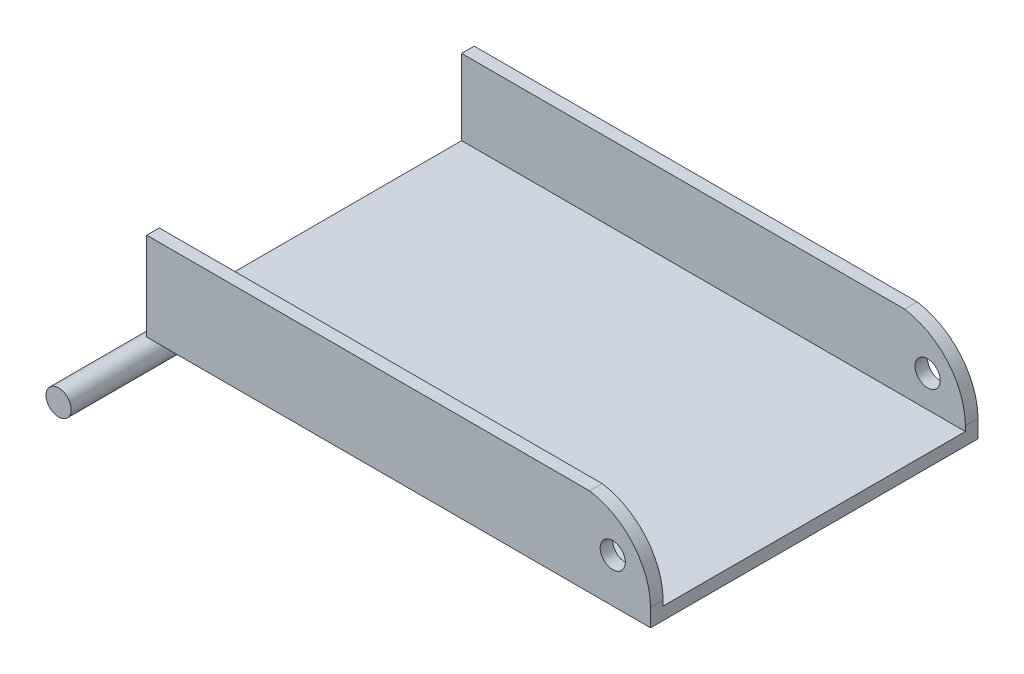
ISO-10303-21;
HEADER;
FILE_DESCRIPTION(('STEP AP214'),'2;1');
FILE_NAME('part.step','',(''),(''),'','','');
FILE_SCHEMA(('AUTOMOTIVE_DESIGN { 1 0 10303 214 1 1 1 1 }'));
ENDSEC;
DATA;
#1=APPLICATION_CONTEXT('core data for automotive mechanical design processes');
#2=APPLICATION_PROTOCOL_DEFINITION('international standard','automotive_design',2000,#1);
#3=PRODUCT_CONTEXT('',#1,'mechanical');
#4=PRODUCT('Part','Part','',(#3));
#5=PRODUCT_RELATED_PRODUCT_CATEGORY('part','',(#4));
#6=PRODUCT_DEFINITION_FORMATION('','',#4);
#7=PRODUCT_DEFINITION_CONTEXT('part definition',#1,'design');
#8=PRODUCT_DEFINITION('design','',#6,#7);
#9=PRODUCT_DEFINITION_SHAPE('','',#8);
#10=(LENGTH_UNIT() NAMED_UNIT(*) SI_UNIT(.MILLI.,.METRE.));
#11=(NAMED_UNIT(*) PLANE_ANGLE_UNIT() SI_UNIT($,.RADIAN.));
#12=(NAMED_UNIT(*) SI_UNIT($,.STERADIAN.) SOLID_ANGLE_UNIT());
#13=UNCERTAINTY_MEASURE_WITH_UNIT(LENGTH_MEASURE(1.E-05),#10,'distance_accuracy_value','');
#14=(GEOMETRIC_REPRESENTATION_CONTEXT(3) GLOBAL_UNCERTAINTY_ASSIGNED_CONTEXT((#13)) GLOBAL_UNIT_ASSIGNED_CONTEXT((#10,
#11,#12)) REPRESENTATION_CONTEXT('',''));
#15=CARTESIAN_POINT('',(0.,0.,0.));
#16=DIRECTION('',(0.,0.,1.));
#17=DIRECTION('',(1.,0.,0.));
#18=AXIS2_PLACEMENT_3D('',#15,#16,#17);
#19=CARTESIAN_POINT('',(200.,5.,165.));
#20=DIRECTION('',(0.,0.,-1.));
#21=DIRECTION('',(0.,1.,0.));
#22=AXIS2_PLACEMENT_3D('',#19,#20,#21);
#23=PLANE('',#22);
#24=CARTESIAN_POINT('',(185.,22.5,165.));
#25=DIRECTION('',(0.,0.,1.));
#26=DIRECTION('',(1.,0.,0.));
#27=AXIS2_PLACEMENT_3D('',#24,#25,#26);
#28=CIRCLE('',#27,4.99999999999999);
#29=CARTESIAN_POINT('',(190.,22.5,165.));
#30=VERTEX_POINT('',#29);
#31=EDGE_CURVE('E187',#30,#30,#28,.T.);
#32=ORIENTED_EDGE('',*,*,#31,.F.);
#33=EDGE_LOOP('',(#32));
#34=FACE_BOUND('',#33,.T.);
#35=DIRECTION('',(0.,-1.,0.));
#36=VECTOR('',#35,1.);
#37=CARTESIAN_POINT('',(200.,5.,165.));
#38=LINE('',#37,#36);
#39=CARTESIAN_POINT('',(200.,11.9855281187863,165.));
#40=VERTEX_POINT('',#39);
#41=CARTESIAN_POINT('',(200.,5.,165.));
#42=VERTEX_POINT('',#41);
#43=EDGE_CURVE('E140',#40,#42,#38,.T.);
#44=ORIENTED_EDGE('',*,*,#43,.F.);
#45=CARTESIAN_POINT('',(171.395114432779,11.7403807463684,165.));
#46=DIRECTION('',(0.,0.,-1.));
#47=DIRECTION('',(-1.,0.,0.));
#48=AXIS2_PLACEMENT_3D('',#45,#46,#47);
#49=CIRCLE('',#48,28.6059360194354);
#50=CARTESIAN_POINT('',(175.83284979981,40.,165.));
#51=VERTEX_POINT('',#50);
#52=EDGE_CURVE('E126',#51,#40,#49,.T.);
#53=ORIENTED_EDGE('',*,*,#52,.F.);
#54=DIRECTION('',(1.,0.,0.));
#55=VECTOR('',#54,1.);
#56=CARTESIAN_POINT('',(0.,40.,165.));
#57=LINE('',#56,#55);
#58=CARTESIAN_POINT('',(0.,40.,165.));
#59=VERTEX_POINT('',#58);
#60=EDGE_CURVE('E212',#59,#51,#57,.T.);
#61=ORIENTED_EDGE('',*,*,#60,.F.);
#62=DIRECTION('',(0.,-1.,0.));
#63=VECTOR('',#62,1.);
#64=CARTESIAN_POINT('',(0.,5.,165.));
#65=LINE('',#64,#63);
#66=CARTESIAN_POINT('',(0.,5.,165.));
#67=VERTEX_POINT('',#66);
#68=EDGE_CURVE('E170',#59,#67,#65,.T.);
#69=ORIENTED_EDGE('',*,*,#68,.T.);
#70=DIRECTION('',(-1.,0.,0.));
#71=VECTOR('',#70,1.);
#72=CARTESIAN_POINT('',(200.,5.,165.));
#73=LINE('',#72,#71);
#74=EDGE_CURVE('E60',#42,#67,#73,.T.);
#75=ORIENTED_EDGE('',*,*,#74,.F.);
#76=EDGE_LOOP('',(#44,#53,#61,#69,#75));
#77=FACE_BOUND('',#76,.T.);
#78=ADVANCED_FACE('F52',(#34,#77),#23,.F.);
#79=CARTESIAN_POINT('',(200.,5.00000000000002,35.));
#80=DIRECTION('',(0.,0.,1.));
#81=DIRECTION('',(0.,-1.,0.));
#82=AXIS2_PLACEMENT_3D('',#79,#80,#81);
#83=PLANE('',#82);
#84=CARTESIAN_POINT('',(185.,22.5,35.0000000000001));
#85=DIRECTION('',(0.,0.,1.));
#86=DIRECTION('',(0.,-1.,0.));
#87=AXIS2_PLACEMENT_3D('',#84,#85,#86);
#88=CIRCLE('',#87,4.99999999999999);
#89=CARTESIAN_POINT('',(185.,17.5,35.0000000000001));
#90=VERTEX_POINT('',#89);
#91=EDGE_CURVE('E193',#90,#90,#88,.T.);
#92=ORIENTED_EDGE('',*,*,#91,.T.);
#93=EDGE_LOOP('',(#92));
#94=FACE_BOUND('',#93,.T.);
#95=DIRECTION('',(-1.,0.,0.));
#96=VECTOR('',#95,1.);
#97=CARTESIAN_POINT('',(0.,40.,35.));
#98=LINE('',#97,#96);
#99=CARTESIAN_POINT('',(175.83284979981,40.,35.));
#100=VERTEX_POINT('',#99);
#101=CARTESIAN_POINT('',(0.,40.,35.));
#102=VERTEX_POINT('',#101);
#103=EDGE_CURVE('E236',#100,#102,#98,.T.);
#104=ORIENTED_EDGE('',*,*,#103,.F.);
#105=CARTESIAN_POINT('',(171.395114432779,11.7403807463684,35.));
#106=DIRECTION('',(0.,0.,1.));
#107=DIRECTION('',(0.,-1.,0.));
#108=AXIS2_PLACEMENT_3D('',#105,#106,#107);
#109=CIRCLE('',#108,28.6059360194354);
#110=CARTESIAN_POINT('',(200.,11.9855281187863,35.));
#111=VERTEX_POINT('',#110);
#112=EDGE_CURVE('E67',#100,#111,#109,.F.);
#113=ORIENTED_EDGE('',*,*,#112,.T.);
#114=DIRECTION('',(0.,1.,0.));
#115=VECTOR('',#114,1.);
#116=CARTESIAN_POINT('',(200.,5.00000000000002,35.));
#117=LINE('',#116,#115);
#118=CARTESIAN_POINT('',(200.,5.00000000000002,35.));
#119=VERTEX_POINT('',#118);
#120=EDGE_CURVE('E156',#119,#111,#117,.T.);
#121=ORIENTED_EDGE('',*,*,#120,.F.);
#122=DIRECTION('',(-1.,0.,0.));
#123=VECTOR('',#122,1.);
#124=CARTESIAN_POINT('',(200.,5.00000000000002,35.));
#125=LINE('',#124,#123);
#126=CARTESIAN_POINT('',(0.,5.00000000000002,35.));
#127=VERTEX_POINT('',#126);
#128=EDGE_CURVE('E169',#119,#127,#125,.T.);
#129=ORIENTED_EDGE('',*,*,#128,.T.);
#130=DIRECTION('',(0.,1.,0.));
#131=VECTOR('',#130,1.);
#132=CARTESIAN_POINT('',(0.,5.00000000000002,35.));
#133=LINE('',#132,#131);
#134=EDGE_CURVE('E158',#127,#102,#133,.T.);
#135=ORIENTED_EDGE('',*,*,#134,.T.);
#136=EDGE_LOOP('',(#104,#113,#121,#129,#135));
#137=FACE_BOUND('',#136,.T.);
#138=ADVANCED_FACE('F277',(#94,#137),#83,.F.);
#139=CARTESIAN_POINT('',(0.,40.,40.));
#140=DIRECTION('',(0.,0.,-1.));
#141=DIRECTION('',(0.,1.,0.));
#142=AXIS2_PLACEMENT_3D('',#139,#140,#141);
#143=PLANE('',#142);
#144=CARTESIAN_POINT('',(185.,22.5,40.));
#145=DIRECTION('',(0.,0.,-1.));
#146=DIRECTION('',(0.,1.,0.));
#147=AXIS2_PLACEMENT_3D('',#144,#145,#146);
#148=CIRCLE('',#147,4.99999999999999);
#149=CARTESIAN_POINT('',(185.,27.5,40.));
#150=VERTEX_POINT('',#149);
#151=EDGE_CURVE('E186',#150,#150,#148,.T.);
#152=ORIENTED_EDGE('',*,*,#151,.T.);
#153=EDGE_LOOP('',(#152));
#154=FACE_BOUND('',#153,.T.);
#155=DIRECTION('',(0.,-1.,0.));
#156=VECTOR('',#155,1.);
#157=CARTESIAN_POINT('',(200.,40.,40.));
#158=LINE('',#157,#156);
#159=CARTESIAN_POINT('',(200.,11.9855281187863,40.));
#160=VERTEX_POINT('',#159);
#161=CARTESIAN_POINT('',(200.,10.,40.));
#162=VERTEX_POINT('',#161);
#163=EDGE_CURVE('E239',#160,#162,#158,.T.);
#164=ORIENTED_EDGE('',*,*,#163,.F.);
#165=CARTESIAN_POINT('',(171.395114432779,11.7403807463684,40.));
#166=DIRECTION('',(0.,0.,-1.));
#167=DIRECTION('',(0.,1.,0.));
#168=AXIS2_PLACEMENT_3D('',#165,#166,#167);
#169=CIRCLE('',#168,28.6059360194354);
#170=CARTESIAN_POINT('',(175.83284979981,40.,40.));
#171=VERTEX_POINT('',#170);
#172=EDGE_CURVE('E200',#160,#171,#169,.F.);
#173=ORIENTED_EDGE('',*,*,#172,.T.);
#174=DIRECTION('',(1.,0.,0.));
#175=VECTOR('',#174,1.);
#176=CARTESIAN_POINT('',(0.,40.,40.));
#177=LINE('',#176,#175);
#178=CARTESIAN_POINT('',(0.,40.,40.));
#179=VERTEX_POINT('',#178);
#180=EDGE_CURVE('E232',#179,#171,#177,.T.);
#181=ORIENTED_EDGE('',*,*,#180,.F.);
#182=DIRECTION('',(0.,-1.,0.));
#183=VECTOR('',#182,1.);
#184=CARTESIAN_POINT('',(0.,40.,40.));
#185=LINE('',#184,#183);
#186=CARTESIAN_POINT('',(0.,10.,40.));
#187=VERTEX_POINT('',#186);
#188=EDGE_CURVE('E161',#179,#187,#185,.T.);
#189=ORIENTED_EDGE('',*,*,#188,.T.);
#190=DIRECTION('',(1.,0.,0.));
#191=VECTOR('',#190,1.);
#192=CARTESIAN_POINT('',(0.,10.,40.));
#193=LINE('',#192,#191);
#194=EDGE_CURVE('E227',#187,#162,#193,.T.);
#195=ORIENTED_EDGE('',*,*,#194,.T.);
#196=EDGE_LOOP('',(#164,#173,#181,#189,#195));
#197=FACE_BOUND('',#196,.T.);
#198=ADVANCED_FACE('F250',(#154,#197),#143,.F.);
#199=CARTESIAN_POINT('',(0.,40.,160.));
#200=DIRECTION('',(0.,0.,1.));
#201=DIRECTION('',(0.,-1.,0.));
#202=AXIS2_PLACEMENT_3D('',#199,#200,#201);
#203=PLANE('',#202);
#204=CARTESIAN_POINT('',(185.,22.5,160.));
#205=DIRECTION('',(0.,0.,1.));
#206=DIRECTION('',(0.,-1.,0.));
#207=AXIS2_PLACEMENT_3D('',#204,#205,#206);
#208=CIRCLE('',#207,4.99999999999999);
#209=CARTESIAN_POINT('',(185.,17.5,160.));
#210=VERTEX_POINT('',#209);
#211=EDGE_CURVE('E183',#210,#210,#208,.T.);
#212=ORIENTED_EDGE('',*,*,#211,.T.);
#213=EDGE_LOOP('',(#212));
#214=FACE_BOUND('',#213,.T.);
#215=DIRECTION('',(-1.,0.,0.));
#216=VECTOR('',#215,1.);
#217=CARTESIAN_POINT('',(0.,40.,160.));
#218=LINE('',#217,#216);
#219=CARTESIAN_POINT('',(175.83284979981,40.,160.));
#220=VERTEX_POINT('',#219);
#221=CARTESIAN_POINT('',(0.,40.,160.));
#222=VERTEX_POINT('',#221);
#223=EDGE_CURVE('E215',#220,#222,#218,.T.);
#224=ORIENTED_EDGE('',*,*,#223,.F.);
#225=CARTESIAN_POINT('',(171.395114432779,11.7403807463684,160.));
#226=DIRECTION('',(0.,0.,1.));
#227=DIRECTION('',(0.,-1.,0.));
#228=AXIS2_PLACEMENT_3D('',#225,#226,#227);
#229=CIRCLE('',#228,28.6059360194354);
#230=CARTESIAN_POINT('',(200.,11.9855281187863,160.));
#231=VERTEX_POINT('',#230);
#232=EDGE_CURVE('E75',#220,#231,#229,.F.);
#233=ORIENTED_EDGE('',*,*,#232,.T.);
#234=DIRECTION('',(0.,-1.,0.));
#235=VECTOR('',#234,1.);
#236=CARTESIAN_POINT('',(200.,40.,160.));
#237=LINE('',#236,#235);
#238=CARTESIAN_POINT('',(200.,10.,160.));
#239=VERTEX_POINT('',#238);
#240=EDGE_CURVE('E143',#231,#239,#237,.T.);
#241=ORIENTED_EDGE('',*,*,#240,.T.);
#242=DIRECTION('',(-1.,0.,0.));
#243=VECTOR('',#242,1.);
#244=CARTESIAN_POINT('',(0.,10.,160.));
#245=LINE('',#244,#243);
#246=CARTESIAN_POINT('',(0.,10.,160.));
#247=VERTEX_POINT('',#246);
#248=EDGE_CURVE('E207',#239,#247,#245,.T.);
#249=ORIENTED_EDGE('',*,*,#248,.T.);
#250=DIRECTION('',(0.,-1.,0.));
#251=VECTOR('',#250,1.);
#252=CARTESIAN_POINT('',(0.,40.,160.));
#253=LINE('',#252,#251);
#254=EDGE_CURVE('E218',#222,#247,#253,.T.);
#255=ORIENTED_EDGE('',*,*,#254,.F.);
#256=EDGE_LOOP('',(#224,#233,#241,#249,#255));
#257=FACE_BOUND('',#256,.T.);
#258=ADVANCED_FACE('F264',(#214,#257),#203,.F.);
#259=CARTESIAN_POINT('',(200.,10.,165.));
#260=DIRECTION('',(0.,-1.,0.));
#261=DIRECTION('',(0.,0.,-1.));
#262=AXIS2_PLACEMENT_3D('',#259,#260,#261);
#263=PLANE('',#262);
#264=ORIENTED_EDGE('',*,*,#248,.F.);
#265=DIRECTION('',(0.,0.,1.));
#266=VECTOR('',#265,1.);
#267=CARTESIAN_POINT('',(200.,10.,165.));
#268=LINE('',#267,#266);
#269=EDGE_CURVE('E166',#162,#239,#268,.T.);
#270=ORIENTED_EDGE('',*,*,#269,.F.);
#271=ORIENTED_EDGE('',*,*,#194,.F.);
#272=DIRECTION('',(0.,0.,1.));
#273=VECTOR('',#272,1.);
#274=CARTESIAN_POINT('',(0.,10.,165.));
#275=LINE('',#274,#273);
#276=EDGE_CURVE('E152',#187,#247,#275,.T.);
#277=ORIENTED_EDGE('',*,*,#276,.T.);
#278=EDGE_LOOP('',(#264,#270,#271,#277));
#279=FACE_BOUND('',#278,.T.);
#280=ADVANCED_FACE('F261',(#279),#263,.F.);
#281=CARTESIAN_POINT('',(200.,5.,165.));
#282=DIRECTION('',(0.,1.,0.));
#283=DIRECTION('',(0.,0.,1.));
#284=AXIS2_PLACEMENT_3D('',#281,#282,#283);
#285=PLANE('',#284);
#286=DIRECTION('',(0.,0.,-1.));
#287=VECTOR('',#286,1.);
#288=CARTESIAN_POINT('',(0.,5.,165.));
#289=LINE('',#288,#287);
#290=EDGE_CURVE('E173',#67,#127,#289,.T.);
#291=ORIENTED_EDGE('',*,*,#290,.T.);
#292=ORIENTED_EDGE('',*,*,#128,.F.);
#293=DIRECTION('',(0.,0.,-1.));
#294=VECTOR('',#293,1.);
#295=CARTESIAN_POINT('',(200.,5.,165.));
#296=LINE('',#295,#294);
#297=EDGE_CURVE('E151',#42,#119,#296,.T.);
#298=ORIENTED_EDGE('',*,*,#297,.F.);
#299=ORIENTED_EDGE('',*,*,#74,.T.);
#300=EDGE_LOOP('',(#291,#292,#298,#299));
#301=FACE_BOUND('',#300,.T.);
#302=ADVANCED_FACE('F280',(#301),#285,.F.);
#303=CARTESIAN_POINT('',(200.,0.,0.));
#304=DIRECTION('',(-1.,0.,0.));
#305=DIRECTION('',(0.,0.,1.));
#306=AXIS2_PLACEMENT_3D('',#303,#304,#305);
#307=PLANE('',#306);
#308=ORIENTED_EDGE('',*,*,#120,.T.);
#309=DIRECTION('',(0.,0.,1.));
#310=VECTOR('',#309,1.);
#311=CARTESIAN_POINT('',(200.,11.9855281187863,0.));
#312=LINE('',#311,#310);
#313=EDGE_CURVE('E145',#111,#160,#312,.T.);
#314=ORIENTED_EDGE('',*,*,#313,.T.);
#315=ORIENTED_EDGE('',*,*,#163,.T.);
#316=ORIENTED_EDGE('',*,*,#269,.T.);
#317=ORIENTED_EDGE('',*,*,#240,.F.);
#318=EDGE_CURVE('E129',#231,#40,#312,.T.);
#319=ORIENTED_EDGE('',*,*,#318,.T.);
#320=ORIENTED_EDGE('',*,*,#43,.T.);
#321=ORIENTED_EDGE('',*,*,#297,.T.);
#322=EDGE_LOOP('',(#308,#314,#315,#316,#317,#319,#320,#321));
#323=FACE_BOUND('',#322,.T.);
#324=ADVANCED_FACE('F139',(#323),#307,.F.);
#325=CARTESIAN_POINT('',(0.,0.,0.));
#326=DIRECTION('',(-1.,0.,0.));
#327=DIRECTION('',(0.,0.,1.));
#328=AXIS2_PLACEMENT_3D('',#325,#326,#327);
#329=PLANE('',#328);
#330=ORIENTED_EDGE('',*,*,#68,.F.);
#331=DIRECTION('',(0.,0.,1.));
#332=VECTOR('',#331,1.);
#333=CARTESIAN_POINT('',(0.,40.,165.));
#334=LINE('',#333,#332);
#335=EDGE_CURVE('E208',#222,#59,#334,.T.);
#336=ORIENTED_EDGE('',*,*,#335,.F.);
#337=ORIENTED_EDGE('',*,*,#254,.T.);
#338=ORIENTED_EDGE('',*,*,#276,.F.);
#339=ORIENTED_EDGE('',*,*,#188,.F.);
#340=DIRECTION('',(0.,0.,1.));
#341=VECTOR('',#340,1.);
#342=CARTESIAN_POINT('',(0.,40.,35.));
#343=LINE('',#342,#341);
#344=EDGE_CURVE('E228',#102,#179,#343,.T.);
#345=ORIENTED_EDGE('',*,*,#344,.F.);
#346=ORIENTED_EDGE('',*,*,#134,.F.);
#347=ORIENTED_EDGE('',*,*,#290,.F.);
#348=EDGE_LOOP('',(#330,#336,#337,#338,#339,#345,#346,#347));
#349=FACE_BOUND('',#348,.T.);
#350=ADVANCED_FACE('F255',(#349),#329,.T.);
#351=CARTESIAN_POINT('',(0.,40.,0.));
#352=DIRECTION('',(0.,1.,0.));
#353=DIRECTION('',(0.,0.,1.));
#354=AXIS2_PLACEMENT_3D('',#351,#352,#353);
#355=PLANE('',#354);
#356=DIRECTION('',(0.,0.,1.));
#357=VECTOR('',#356,1.);
#358=CARTESIAN_POINT('',(175.83284979981,40.,0.));
#359=LINE('',#358,#357);
#360=EDGE_CURVE('E266',#100,#171,#359,.T.);
#361=ORIENTED_EDGE('',*,*,#360,.F.);
#362=ORIENTED_EDGE('',*,*,#103,.T.);
#363=ORIENTED_EDGE('',*,*,#344,.T.);
#364=ORIENTED_EDGE('',*,*,#180,.T.);
#365=EDGE_LOOP('',(#361,#362,#363,#364));
#366=FACE_BOUND('',#365,.T.);
#367=ADVANCED_FACE('F274',(#366),#355,.T.);
#368=CARTESIAN_POINT('',(0.,40.0000000000001,0.));
#369=DIRECTION('',(0.,-1.,0.));
#370=DIRECTION('',(0.,0.,-1.));
#371=AXIS2_PLACEMENT_3D('',#368,#369,#370);
#372=PLANE('',#371);
#373=ORIENTED_EDGE('',*,*,#60,.T.);
#374=DIRECTION('',(0.,0.,-1.));
#375=VECTOR('',#374,1.);
#376=CARTESIAN_POINT('',(175.83284979981,40.0000000000001,0.));
#377=LINE('',#376,#375);
#378=EDGE_CURVE('E12',#51,#220,#377,.T.);
#379=ORIENTED_EDGE('',*,*,#378,.T.);
#380=ORIENTED_EDGE('',*,*,#223,.T.);
#381=ORIENTED_EDGE('',*,*,#335,.T.);
#382=EDGE_LOOP('',(#373,#379,#380,#381));
#383=FACE_BOUND('',#382,.T.);
#384=ADVANCED_FACE('F282',(#383),#372,.F.);
#385=CARTESIAN_POINT('',(185.,22.5,0.));
#386=DIRECTION('',(0.,0.,1.));
#387=DIRECTION('',(1.,0.,0.));
#388=AXIS2_PLACEMENT_3D('',#385,#386,#387);
#389=CYLINDRICAL_SURFACE('',#388,4.99999999999999);
#390=ORIENTED_EDGE('',*,*,#31,.T.);
#391=EDGE_LOOP('',(#390));
#392=FACE_BOUND('',#391,.T.);
#393=ORIENTED_EDGE('',*,*,#211,.F.);
#394=EDGE_LOOP('',(#393));
#395=FACE_BOUND('',#394,.T.);
#396=ADVANCED_FACE('F284',(#392,#395),#389,.F.);
#397=ORIENTED_EDGE('',*,*,#151,.F.);
#398=EDGE_LOOP('',(#397));
#399=FACE_BOUND('',#398,.T.);
#400=ORIENTED_EDGE('',*,*,#91,.F.);
#401=EDGE_LOOP('',(#400));
#402=FACE_BOUND('',#401,.T.);
#403=ADVANCED_FACE('F290',(#399,#402),#389,.F.);
#404=CARTESIAN_POINT('',(171.395114432779,11.7403807463684,0.));
#405=DIRECTION('',(0.,0.,1.));
#406=DIRECTION('',(1.,0.,0.));
#407=AXIS2_PLACEMENT_3D('',#404,#405,#406);
#408=CYLINDRICAL_SURFACE('',#407,28.6059360194354);
#409=ORIENTED_EDGE('',*,*,#378,.F.);
#410=ORIENTED_EDGE('',*,*,#52,.T.);
#411=ORIENTED_EDGE('',*,*,#318,.F.);
#412=ORIENTED_EDGE('',*,*,#232,.F.);
#413=EDGE_LOOP('',(#409,#410,#411,#412));
#414=FACE_BOUND('',#413,.T.);
#415=ADVANCED_FACE('F128',(#414),#408,.T.);
#416=ORIENTED_EDGE('',*,*,#360,.T.);
#417=ORIENTED_EDGE('',*,*,#172,.F.);
#418=ORIENTED_EDGE('',*,*,#313,.F.);
#419=ORIENTED_EDGE('',*,*,#112,.F.);
#420=EDGE_LOOP('',(#416,#417,#418,#419));
#421=FACE_BOUND('',#420,.T.);
#422=ADVANCED_FACE('F345',(#421),#408,.T.);
#423=CLOSED_SHELL('',(#78,#138,#198,#258,#280,#302,#324,#350,#367,#384,#396,#403,#415,#422));
#424=MANIFOLD_SOLID_BREP('B2',#423);
#425=CARTESIAN_POINT('',(0.,0.,200.));
#426=DIRECTION('',(0.,0.,-1.));
#427=DIRECTION('',(-1.,0.,0.));
#428=AXIS2_PLACEMENT_3D('',#425,#426,#427);
#429=CYLINDRICAL_SURFACE('',#428,5.);
#430=CARTESIAN_POINT('',(0.,0.,200.));
#431=DIRECTION('',(0.,0.,1.));
#432=DIRECTION('',(1.,0.,0.));
#433=AXIS2_PLACEMENT_3D('',#430,#431,#432);
#434=CIRCLE('',#433,5.);
#435=CARTESIAN_POINT('',(5.,0.,200.));
#436=VERTEX_POINT('',#435);
#437=EDGE_CURVE('E51',#436,#436,#434,.T.);
#438=ORIENTED_EDGE('',*,*,#437,.F.);
#439=EDGE_LOOP('',(#438));
#440=FACE_BOUND('',#439,.T.);
#441=CARTESIAN_POINT('',(0.,0.,0.));
#442=DIRECTION('',(0.,0.,1.));
#443=DIRECTION('',(1.,0.,0.));
#444=AXIS2_PLACEMENT_3D('',#441,#442,#443);
#445=CIRCLE('',#444,5.);
#446=CARTESIAN_POINT('',(5.,0.,0.));
#447=VERTEX_POINT('',#446);
#448=EDGE_CURVE('E431',#447,#447,#445,.T.);
#449=ORIENTED_EDGE('',*,*,#448,.T.);
#450=EDGE_LOOP('',(#449));
#451=FACE_BOUND('',#450,.T.);
#452=ADVANCED_FACE('F428',(#440,#451),#429,.T.);
#453=CARTESIAN_POINT('',(0.,0.,200.));
#454=DIRECTION('',(0.,0.,1.));
#455=DIRECTION('',(1.,0.,0.));
#456=AXIS2_PLACEMENT_3D('',#453,#454,#455);
#457=PLANE('',#456);
#458=ORIENTED_EDGE('',*,*,#437,.T.);
#459=EDGE_LOOP('',(#458));
#460=FACE_BOUND('',#459,.T.);
#461=ADVANCED_FACE('F443',(#460),#457,.T.);
#462=CARTESIAN_POINT('',(0.,0.,0.));
#463=DIRECTION('',(0.,0.,1.));
#464=DIRECTION('',(1.,0.,0.));
#465=AXIS2_PLACEMENT_3D('',#462,#463,#464);
#466=PLANE('',#465);
#467=ORIENTED_EDGE('',*,*,#448,.F.);
#468=EDGE_LOOP('',(#467));
#469=FACE_BOUND('',#468,.T.);
#470=ADVANCED_FACE('F441',(#469),#466,.F.);
#471=CLOSED_SHELL('',(#452,#461,#470));
#472=MANIFOLD_SOLID_BREP('B6',#471);
#473=ADVANCED_BREP_SHAPE_REPRESENTATION('',(#18,#424,#472),#14);
#474=SHAPE_DEFINITION_REPRESENTATION(#9,#473);
ENDSEC;
END-ISO-10303-21;
